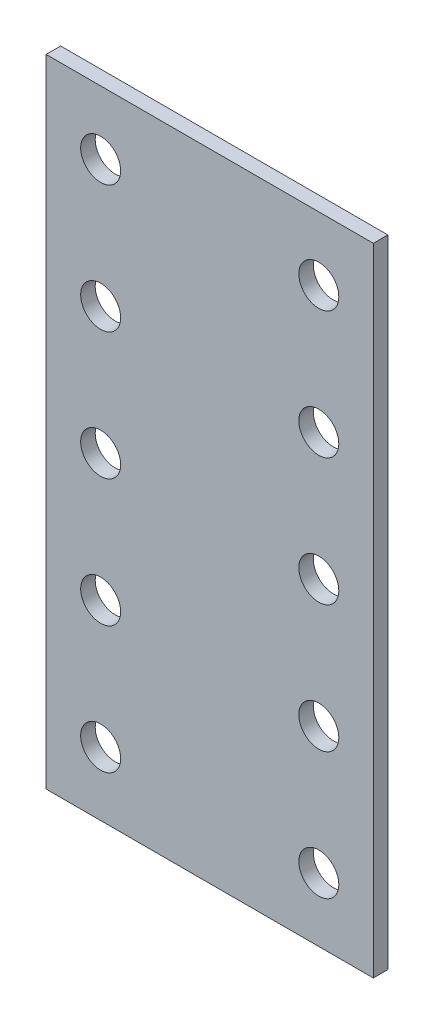
ISO-10303-21;
HEADER;
FILE_DESCRIPTION(('STEP AP214'),'2;1');
FILE_NAME('part.step','',(''),(''),'','','');
FILE_SCHEMA(('AUTOMOTIVE_DESIGN { 1 0 10303 214 1 1 1 1 }'));
ENDSEC;
DATA;
#1=APPLICATION_CONTEXT('core data for automotive mechanical design processes');
#2=APPLICATION_PROTOCOL_DEFINITION('international standard','automotive_design',2000,#1);
#3=PRODUCT_CONTEXT('',#1,'mechanical');
#4=PRODUCT('Part','Part','',(#3));
#5=PRODUCT_RELATED_PRODUCT_CATEGORY('part','',(#4));
#6=PRODUCT_DEFINITION_FORMATION('','',#4);
#7=PRODUCT_DEFINITION_CONTEXT('part definition',#1,'design');
#8=PRODUCT_DEFINITION('design','',#6,#7);
#9=PRODUCT_DEFINITION_SHAPE('','',#8);
#10=(LENGTH_UNIT() NAMED_UNIT(*) SI_UNIT(.MILLI.,.METRE.));
#11=(NAMED_UNIT(*) PLANE_ANGLE_UNIT() SI_UNIT($,.RADIAN.));
#12=(NAMED_UNIT(*) SI_UNIT($,.STERADIAN.) SOLID_ANGLE_UNIT());
#13=UNCERTAINTY_MEASURE_WITH_UNIT(LENGTH_MEASURE(1.E-05),#10,'distance_accuracy_value','');
#14=(GEOMETRIC_REPRESENTATION_CONTEXT(3) GLOBAL_UNCERTAINTY_ASSIGNED_CONTEXT((#13)) GLOBAL_UNIT_ASSIGNED_CONTEXT((#10,
#11,#12)) REPRESENTATION_CONTEXT('',''));
#15=CARTESIAN_POINT('',(0.,0.,0.));
#16=DIRECTION('',(0.,0.,1.));
#17=DIRECTION('',(1.,0.,0.));
#18=AXIS2_PLACEMENT_3D('',#15,#16,#17);
#19=CARTESIAN_POINT('',(60.,-140.,4.));
#20=DIRECTION('',(0.,0.,1.));
#21=DIRECTION('',(1.,0.,0.));
#22=AXIS2_PLACEMENT_3D('',#19,#20,#21);
#23=CYLINDRICAL_SURFACE('',#22,11.);
#24=CARTESIAN_POINT('',(60.,-140.,4.));
#25=DIRECTION('',(0.,0.,1.));
#26=DIRECTION('',(1.,0.,0.));
#27=AXIS2_PLACEMENT_3D('',#24,#25,#26);
#28=CIRCLE('',#27,11.);
#29=CARTESIAN_POINT('',(71.,-140.,4.));
#30=VERTEX_POINT('',#29);
#31=EDGE_CURVE('E49',#30,#30,#28,.T.);
#32=ORIENTED_EDGE('',*,*,#31,.T.);
#33=EDGE_LOOP('',(#32));
#34=FACE_BOUND('',#33,.T.);
#35=CARTESIAN_POINT('',(60.,-140.,-4.));
#36=DIRECTION('',(0.,0.,-1.));
#37=DIRECTION('',(-1.,0.,0.));
#38=AXIS2_PLACEMENT_3D('',#35,#36,#37);
#39=CIRCLE('',#38,11.);
#40=CARTESIAN_POINT('',(49.,-140.,-4.));
#41=VERTEX_POINT('',#40);
#42=EDGE_CURVE('E11',#41,#41,#39,.T.);
#43=ORIENTED_EDGE('',*,*,#42,.T.);
#44=EDGE_LOOP('',(#43));
#45=FACE_BOUND('',#44,.T.);
#46=ADVANCED_FACE('F41',(#34,#45),#23,.F.);
#47=CARTESIAN_POINT('',(60.,-70.,4.));
#48=DIRECTION('',(0.,0.,1.));
#49=DIRECTION('',(1.,0.,0.));
#50=AXIS2_PLACEMENT_3D('',#47,#48,#49);
#51=CYLINDRICAL_SURFACE('',#50,11.);
#52=CARTESIAN_POINT('',(60.,-70.,4.));
#53=DIRECTION('',(0.,0.,1.));
#54=DIRECTION('',(1.,0.,0.));
#55=AXIS2_PLACEMENT_3D('',#52,#53,#54);
#56=CIRCLE('',#55,11.);
#57=CARTESIAN_POINT('',(71.,-70.,4.));
#58=VERTEX_POINT('',#57);
#59=EDGE_CURVE('E146',#58,#58,#56,.T.);
#60=ORIENTED_EDGE('',*,*,#59,.T.);
#61=EDGE_LOOP('',(#60));
#62=FACE_BOUND('',#61,.T.);
#63=CARTESIAN_POINT('',(60.,-70.,-4.));
#64=DIRECTION('',(0.,0.,-1.));
#65=DIRECTION('',(-1.,0.,0.));
#66=AXIS2_PLACEMENT_3D('',#63,#64,#65);
#67=CIRCLE('',#66,11.);
#68=CARTESIAN_POINT('',(49.,-70.,-4.));
#69=VERTEX_POINT('',#68);
#70=EDGE_CURVE('E149',#69,#69,#67,.T.);
#71=ORIENTED_EDGE('',*,*,#70,.T.);
#72=EDGE_LOOP('',(#71));
#73=FACE_BOUND('',#72,.T.);
#74=ADVANCED_FACE('F175',(#62,#73),#51,.F.);
#75=CARTESIAN_POINT('',(60.,0.,4.));
#76=DIRECTION('',(0.,0.,1.));
#77=DIRECTION('',(1.,0.,0.));
#78=AXIS2_PLACEMENT_3D('',#75,#76,#77);
#79=CYLINDRICAL_SURFACE('',#78,11.);
#80=CARTESIAN_POINT('',(60.,0.,4.));
#81=DIRECTION('',(0.,0.,1.));
#82=DIRECTION('',(1.,0.,0.));
#83=AXIS2_PLACEMENT_3D('',#80,#81,#82);
#84=CIRCLE('',#83,11.);
#85=CARTESIAN_POINT('',(71.,0.,4.));
#86=VERTEX_POINT('',#85);
#87=EDGE_CURVE('E140',#86,#86,#84,.T.);
#88=ORIENTED_EDGE('',*,*,#87,.T.);
#89=EDGE_LOOP('',(#88));
#90=FACE_BOUND('',#89,.T.);
#91=CARTESIAN_POINT('',(60.,0.,-4.));
#92=DIRECTION('',(0.,0.,-1.));
#93=DIRECTION('',(-1.,0.,0.));
#94=AXIS2_PLACEMENT_3D('',#91,#92,#93);
#95=CIRCLE('',#94,11.);
#96=CARTESIAN_POINT('',(49.,0.,-4.));
#97=VERTEX_POINT('',#96);
#98=EDGE_CURVE('E143',#97,#97,#95,.T.);
#99=ORIENTED_EDGE('',*,*,#98,.T.);
#100=EDGE_LOOP('',(#99));
#101=FACE_BOUND('',#100,.T.);
#102=ADVANCED_FACE('F180',(#90,#101),#79,.F.);
#103=CARTESIAN_POINT('',(-60.,-140.,4.));
#104=DIRECTION('',(0.,0.,1.));
#105=DIRECTION('',(1.,0.,0.));
#106=AXIS2_PLACEMENT_3D('',#103,#104,#105);
#107=CYLINDRICAL_SURFACE('',#106,11.);
#108=CARTESIAN_POINT('',(-60.,-140.,4.));
#109=DIRECTION('',(0.,0.,1.));
#110=DIRECTION('',(1.,0.,0.));
#111=AXIS2_PLACEMENT_3D('',#108,#109,#110);
#112=CIRCLE('',#111,11.);
#113=CARTESIAN_POINT('',(-49.,-140.,4.));
#114=VERTEX_POINT('',#113);
#115=EDGE_CURVE('E134',#114,#114,#112,.T.);
#116=ORIENTED_EDGE('',*,*,#115,.T.);
#117=EDGE_LOOP('',(#116));
#118=FACE_BOUND('',#117,.T.);
#119=CARTESIAN_POINT('',(-60.,-140.,-4.));
#120=DIRECTION('',(0.,0.,-1.));
#121=DIRECTION('',(-1.,0.,0.));
#122=AXIS2_PLACEMENT_3D('',#119,#120,#121);
#123=CIRCLE('',#122,11.);
#124=CARTESIAN_POINT('',(-71.,-140.,-4.));
#125=VERTEX_POINT('',#124);
#126=EDGE_CURVE('E137',#125,#125,#123,.T.);
#127=ORIENTED_EDGE('',*,*,#126,.T.);
#128=EDGE_LOOP('',(#127));
#129=FACE_BOUND('',#128,.T.);
#130=ADVANCED_FACE('F185',(#118,#129),#107,.F.);
#131=CARTESIAN_POINT('',(-60.,-70.,4.));
#132=DIRECTION('',(0.,0.,1.));
#133=DIRECTION('',(1.,0.,0.));
#134=AXIS2_PLACEMENT_3D('',#131,#132,#133);
#135=CYLINDRICAL_SURFACE('',#134,11.);
#136=CARTESIAN_POINT('',(-60.,-70.,4.));
#137=DIRECTION('',(0.,0.,1.));
#138=DIRECTION('',(1.,0.,0.));
#139=AXIS2_PLACEMENT_3D('',#136,#137,#138);
#140=CIRCLE('',#139,11.);
#141=CARTESIAN_POINT('',(-49.,-70.,4.));
#142=VERTEX_POINT('',#141);
#143=EDGE_CURVE('E128',#142,#142,#140,.T.);
#144=ORIENTED_EDGE('',*,*,#143,.T.);
#145=EDGE_LOOP('',(#144));
#146=FACE_BOUND('',#145,.T.);
#147=CARTESIAN_POINT('',(-60.,-70.,-4.));
#148=DIRECTION('',(0.,0.,-1.));
#149=DIRECTION('',(-1.,0.,0.));
#150=AXIS2_PLACEMENT_3D('',#147,#148,#149);
#151=CIRCLE('',#150,11.);
#152=CARTESIAN_POINT('',(-71.,-70.,-4.));
#153=VERTEX_POINT('',#152);
#154=EDGE_CURVE('E131',#153,#153,#151,.T.);
#155=ORIENTED_EDGE('',*,*,#154,.T.);
#156=EDGE_LOOP('',(#155));
#157=FACE_BOUND('',#156,.T.);
#158=ADVANCED_FACE('F192',(#146,#157),#135,.F.);
#159=CARTESIAN_POINT('',(-60.,0.,4.));
#160=DIRECTION('',(0.,0.,1.));
#161=DIRECTION('',(1.,0.,0.));
#162=AXIS2_PLACEMENT_3D('',#159,#160,#161);
#163=CYLINDRICAL_SURFACE('',#162,11.);
#164=CARTESIAN_POINT('',(-60.,0.,4.));
#165=DIRECTION('',(0.,0.,1.));
#166=DIRECTION('',(1.,0.,0.));
#167=AXIS2_PLACEMENT_3D('',#164,#165,#166);
#168=CIRCLE('',#167,11.);
#169=CARTESIAN_POINT('',(-49.,0.,4.));
#170=VERTEX_POINT('',#169);
#171=EDGE_CURVE('E120',#170,#170,#168,.T.);
#172=ORIENTED_EDGE('',*,*,#171,.T.);
#173=EDGE_LOOP('',(#172));
#174=FACE_BOUND('',#173,.T.);
#175=CARTESIAN_POINT('',(-60.,0.,-4.));
#176=DIRECTION('',(0.,0.,-1.));
#177=DIRECTION('',(-1.,0.,0.));
#178=AXIS2_PLACEMENT_3D('',#175,#176,#177);
#179=CIRCLE('',#178,11.);
#180=CARTESIAN_POINT('',(-71.,0.,-4.));
#181=VERTEX_POINT('',#180);
#182=EDGE_CURVE('E125',#181,#181,#179,.T.);
#183=ORIENTED_EDGE('',*,*,#182,.T.);
#184=EDGE_LOOP('',(#183));
#185=FACE_BOUND('',#184,.T.);
#186=ADVANCED_FACE('F196',(#174,#185),#163,.F.);
#187=CARTESIAN_POINT('',(90.,-175.,-4.));
#188=DIRECTION('',(1.,0.,0.));
#189=DIRECTION('',(0.,0.,-1.));
#190=AXIS2_PLACEMENT_3D('',#187,#188,#189);
#191=PLANE('',#190);
#192=DIRECTION('',(0.,1.,0.));
#193=VECTOR('',#192,1.);
#194=CARTESIAN_POINT('',(90.,-175.,4.));
#195=LINE('',#194,#193);
#196=CARTESIAN_POINT('',(90.,-175.,4.));
#197=VERTEX_POINT('',#196);
#198=CARTESIAN_POINT('',(90.,175.,4.));
#199=VERTEX_POINT('',#198);
#200=EDGE_CURVE('E110',#197,#199,#195,.T.);
#201=ORIENTED_EDGE('',*,*,#200,.F.);
#202=DIRECTION('',(0.,0.,1.));
#203=VECTOR('',#202,1.);
#204=CARTESIAN_POINT('',(90.,-175.,-4.));
#205=LINE('',#204,#203);
#206=CARTESIAN_POINT('',(90.,-175.,-4.));
#207=VERTEX_POINT('',#206);
#208=EDGE_CURVE('E57',#207,#197,#205,.T.);
#209=ORIENTED_EDGE('',*,*,#208,.F.);
#210=DIRECTION('',(0.,1.,0.));
#211=VECTOR('',#210,1.);
#212=CARTESIAN_POINT('',(90.,-175.,-4.));
#213=LINE('',#212,#211);
#214=CARTESIAN_POINT('',(90.,175.,-4.));
#215=VERTEX_POINT('',#214);
#216=EDGE_CURVE('E103',#207,#215,#213,.T.);
#217=ORIENTED_EDGE('',*,*,#216,.T.);
#218=DIRECTION('',(0.,0.,1.));
#219=VECTOR('',#218,1.);
#220=CARTESIAN_POINT('',(90.,175.,-4.));
#221=LINE('',#220,#219);
#222=EDGE_CURVE('E85',#215,#199,#221,.T.);
#223=ORIENTED_EDGE('',*,*,#222,.T.);
#224=EDGE_LOOP('',(#201,#209,#217,#223));
#225=FACE_BOUND('',#224,.T.);
#226=ADVANCED_FACE('F200',(#225),#191,.T.);
#227=CARTESIAN_POINT('',(-90.,-175.,-4.));
#228=DIRECTION('',(0.,-1.,0.));
#229=DIRECTION('',(0.,0.,-1.));
#230=AXIS2_PLACEMENT_3D('',#227,#228,#229);
#231=PLANE('',#230);
#232=DIRECTION('',(1.,0.,0.));
#233=VECTOR('',#232,1.);
#234=CARTESIAN_POINT('',(-90.,-175.,4.));
#235=LINE('',#234,#233);
#236=CARTESIAN_POINT('',(-90.,-175.,4.));
#237=VERTEX_POINT('',#236);
#238=EDGE_CURVE('E105',#237,#197,#235,.T.);
#239=ORIENTED_EDGE('',*,*,#238,.F.);
#240=DIRECTION('',(0.,0.,1.));
#241=VECTOR('',#240,1.);
#242=CARTESIAN_POINT('',(-90.,-175.,-4.));
#243=LINE('',#242,#241);
#244=CARTESIAN_POINT('',(-90.,-175.,-4.));
#245=VERTEX_POINT('',#244);
#246=EDGE_CURVE('E74',#245,#237,#243,.T.);
#247=ORIENTED_EDGE('',*,*,#246,.F.);
#248=DIRECTION('',(1.,0.,0.));
#249=VECTOR('',#248,1.);
#250=CARTESIAN_POINT('',(-90.,-175.,-4.));
#251=LINE('',#250,#249);
#252=EDGE_CURVE('E100',#245,#207,#251,.T.);
#253=ORIENTED_EDGE('',*,*,#252,.T.);
#254=ORIENTED_EDGE('',*,*,#208,.T.);
#255=EDGE_LOOP('',(#239,#247,#253,#254));
#256=FACE_BOUND('',#255,.T.);
#257=ADVANCED_FACE('F204',(#256),#231,.T.);
#258=CARTESIAN_POINT('',(-90.,-175.,-4.));
#259=DIRECTION('',(-1.,0.,0.));
#260=DIRECTION('',(0.,0.,1.));
#261=AXIS2_PLACEMENT_3D('',#258,#259,#260);
#262=PLANE('',#261);
#263=DIRECTION('',(0.,-1.,0.));
#264=VECTOR('',#263,1.);
#265=CARTESIAN_POINT('',(-90.,-175.,4.));
#266=LINE('',#265,#264);
#267=CARTESIAN_POINT('',(-90.,175.,4.));
#268=VERTEX_POINT('',#267);
#269=EDGE_CURVE('E93',#268,#237,#266,.T.);
#270=ORIENTED_EDGE('',*,*,#269,.F.);
#271=DIRECTION('',(0.,0.,1.));
#272=VECTOR('',#271,1.);
#273=CARTESIAN_POINT('',(-90.,175.,-4.));
#274=LINE('',#273,#272);
#275=CARTESIAN_POINT('',(-90.,175.,-4.));
#276=VERTEX_POINT('',#275);
#277=EDGE_CURVE('E88',#276,#268,#274,.T.);
#278=ORIENTED_EDGE('',*,*,#277,.F.);
#279=DIRECTION('',(0.,-1.,0.));
#280=VECTOR('',#279,1.);
#281=CARTESIAN_POINT('',(-90.,-175.,-4.));
#282=LINE('',#281,#280);
#283=EDGE_CURVE('E91',#276,#245,#282,.T.);
#284=ORIENTED_EDGE('',*,*,#283,.T.);
#285=ORIENTED_EDGE('',*,*,#246,.T.);
#286=EDGE_LOOP('',(#270,#278,#284,#285));
#287=FACE_BOUND('',#286,.T.);
#288=ADVANCED_FACE('F90',(#287),#262,.T.);
#289=CARTESIAN_POINT('',(-90.,175.,-4.));
#290=DIRECTION('',(0.,1.,0.));
#291=DIRECTION('',(0.,0.,1.));
#292=AXIS2_PLACEMENT_3D('',#289,#290,#291);
#293=PLANE('',#292);
#294=DIRECTION('',(-1.,0.,0.));
#295=VECTOR('',#294,1.);
#296=CARTESIAN_POINT('',(-90.,175.,4.));
#297=LINE('',#296,#295);
#298=EDGE_CURVE('E113',#199,#268,#297,.T.);
#299=ORIENTED_EDGE('',*,*,#298,.F.);
#300=ORIENTED_EDGE('',*,*,#222,.F.);
#301=DIRECTION('',(-1.,0.,0.));
#302=VECTOR('',#301,1.);
#303=CARTESIAN_POINT('',(-90.,175.,-4.));
#304=LINE('',#303,#302);
#305=EDGE_CURVE('E99',#215,#276,#304,.T.);
#306=ORIENTED_EDGE('',*,*,#305,.T.);
#307=ORIENTED_EDGE('',*,*,#277,.T.);
#308=EDGE_LOOP('',(#299,#300,#306,#307));
#309=FACE_BOUND('',#308,.T.);
#310=ADVANCED_FACE('F102',(#309),#293,.T.);
#311=CARTESIAN_POINT('',(0.,0.,-4.));
#312=DIRECTION('',(0.,0.,-1.));
#313=DIRECTION('',(-1.,0.,0.));
#314=AXIS2_PLACEMENT_3D('',#311,#312,#313);
#315=PLANE('',#314);
#316=CARTESIAN_POINT('',(60.,70.,-4.));
#317=DIRECTION('',(0.,0.,-1.));
#318=DIRECTION('',(-1.,0.,0.));
#319=AXIS2_PLACEMENT_3D('',#316,#317,#318);
#320=CIRCLE('',#319,11.);
#321=CARTESIAN_POINT('',(49.,70.,-4.));
#322=VERTEX_POINT('',#321);
#323=EDGE_CURVE('E322',#322,#322,#320,.T.);
#324=ORIENTED_EDGE('',*,*,#323,.F.);
#325=EDGE_LOOP('',(#324));
#326=FACE_BOUND('',#325,.T.);
#327=CARTESIAN_POINT('',(-60.,70.,-4.));
#328=DIRECTION('',(0.,0.,-1.));
#329=DIRECTION('',(-1.,0.,0.));
#330=AXIS2_PLACEMENT_3D('',#327,#328,#329);
#331=CIRCLE('',#330,11.);
#332=CARTESIAN_POINT('',(-71.,70.,-4.));
#333=VERTEX_POINT('',#332);
#334=EDGE_CURVE('E326',#333,#333,#331,.T.);
#335=ORIENTED_EDGE('',*,*,#334,.F.);
#336=EDGE_LOOP('',(#335));
#337=FACE_BOUND('',#336,.T.);
#338=CARTESIAN_POINT('',(-60.,140.,-4.));
#339=DIRECTION('',(0.,0.,-1.));
#340=DIRECTION('',(-1.,0.,0.));
#341=AXIS2_PLACEMENT_3D('',#338,#339,#340);
#342=CIRCLE('',#341,11.);
#343=CARTESIAN_POINT('',(-71.,140.,-4.));
#344=VERTEX_POINT('',#343);
#345=EDGE_CURVE('E335',#344,#344,#342,.T.);
#346=ORIENTED_EDGE('',*,*,#345,.F.);
#347=EDGE_LOOP('',(#346));
#348=FACE_BOUND('',#347,.T.);
#349=CARTESIAN_POINT('',(60.,140.,-4.));
#350=DIRECTION('',(0.,0.,-1.));
#351=DIRECTION('',(-1.,0.,0.));
#352=AXIS2_PLACEMENT_3D('',#349,#350,#351);
#353=CIRCLE('',#352,11.);
#354=CARTESIAN_POINT('',(49.,140.,-4.));
#355=VERTEX_POINT('',#354);
#356=EDGE_CURVE('E114',#355,#355,#353,.T.);
#357=ORIENTED_EDGE('',*,*,#356,.F.);
#358=EDGE_LOOP('',(#357));
#359=FACE_BOUND('',#358,.T.);
#360=ORIENTED_EDGE('',*,*,#216,.F.);
#361=ORIENTED_EDGE('',*,*,#252,.F.);
#362=ORIENTED_EDGE('',*,*,#283,.F.);
#363=ORIENTED_EDGE('',*,*,#305,.F.);
#364=EDGE_LOOP('',(#360,#361,#362,#363));
#365=FACE_BOUND('',#364,.T.);
#366=ORIENTED_EDGE('',*,*,#182,.F.);
#367=EDGE_LOOP('',(#366));
#368=FACE_BOUND('',#367,.T.);
#369=ORIENTED_EDGE('',*,*,#154,.F.);
#370=EDGE_LOOP('',(#369));
#371=FACE_BOUND('',#370,.T.);
#372=ORIENTED_EDGE('',*,*,#126,.F.);
#373=EDGE_LOOP('',(#372));
#374=FACE_BOUND('',#373,.T.);
#375=ORIENTED_EDGE('',*,*,#98,.F.);
#376=EDGE_LOOP('',(#375));
#377=FACE_BOUND('',#376,.T.);
#378=ORIENTED_EDGE('',*,*,#70,.F.);
#379=EDGE_LOOP('',(#378));
#380=FACE_BOUND('',#379,.T.);
#381=ORIENTED_EDGE('',*,*,#42,.F.);
#382=EDGE_LOOP('',(#381));
#383=FACE_BOUND('',#382,.T.);
#384=ADVANCED_FACE('F97',(#326,#337,#348,#359,#365,#368,#371,#374,#377,#380,#383),#315,.T.);
#385=CARTESIAN_POINT('',(0.,0.,4.));
#386=DIRECTION('',(0.,0.,-1.));
#387=DIRECTION('',(-1.,0.,0.));
#388=AXIS2_PLACEMENT_3D('',#385,#386,#387);
#389=PLANE('',#388);
#390=CARTESIAN_POINT('',(60.,70.,4.));
#391=DIRECTION('',(0.,0.,1.));
#392=DIRECTION('',(1.,0.,0.));
#393=AXIS2_PLACEMENT_3D('',#390,#391,#392);
#394=CIRCLE('',#393,11.);
#395=CARTESIAN_POINT('',(71.,70.,4.));
#396=VERTEX_POINT('',#395);
#397=EDGE_CURVE('E319',#396,#396,#394,.T.);
#398=ORIENTED_EDGE('',*,*,#397,.F.);
#399=EDGE_LOOP('',(#398));
#400=FACE_BOUND('',#399,.T.);
#401=CARTESIAN_POINT('',(-60.,70.,4.));
#402=DIRECTION('',(0.,0.,1.));
#403=DIRECTION('',(1.,0.,0.));
#404=AXIS2_PLACEMENT_3D('',#401,#402,#403);
#405=CIRCLE('',#404,11.);
#406=CARTESIAN_POINT('',(-49.,70.,4.));
#407=VERTEX_POINT('',#406);
#408=EDGE_CURVE('E323',#407,#407,#405,.T.);
#409=ORIENTED_EDGE('',*,*,#408,.F.);
#410=EDGE_LOOP('',(#409));
#411=FACE_BOUND('',#410,.T.);
#412=CARTESIAN_POINT('',(-60.,140.,4.));
#413=DIRECTION('',(0.,0.,1.));
#414=DIRECTION('',(1.,0.,0.));
#415=AXIS2_PLACEMENT_3D('',#412,#413,#414);
#416=CIRCLE('',#415,11.);
#417=CARTESIAN_POINT('',(-49.,140.,4.));
#418=VERTEX_POINT('',#417);
#419=EDGE_CURVE('E332',#418,#418,#416,.T.);
#420=ORIENTED_EDGE('',*,*,#419,.F.);
#421=EDGE_LOOP('',(#420));
#422=FACE_BOUND('',#421,.T.);
#423=CARTESIAN_POINT('',(60.,140.,4.));
#424=DIRECTION('',(0.,0.,1.));
#425=DIRECTION('',(1.,0.,0.));
#426=AXIS2_PLACEMENT_3D('',#423,#424,#425);
#427=CIRCLE('',#426,11.);
#428=CARTESIAN_POINT('',(71.,140.,4.));
#429=VERTEX_POINT('',#428);
#430=EDGE_CURVE('E338',#429,#429,#427,.T.);
#431=ORIENTED_EDGE('',*,*,#430,.F.);
#432=EDGE_LOOP('',(#431));
#433=FACE_BOUND('',#432,.T.);
#434=ORIENTED_EDGE('',*,*,#200,.T.);
#435=ORIENTED_EDGE('',*,*,#298,.T.);
#436=ORIENTED_EDGE('',*,*,#269,.T.);
#437=ORIENTED_EDGE('',*,*,#238,.T.);
#438=EDGE_LOOP('',(#434,#435,#436,#437));
#439=FACE_BOUND('',#438,.T.);
#440=ORIENTED_EDGE('',*,*,#171,.F.);
#441=EDGE_LOOP('',(#440));
#442=FACE_BOUND('',#441,.T.);
#443=ORIENTED_EDGE('',*,*,#143,.F.);
#444=EDGE_LOOP('',(#443));
#445=FACE_BOUND('',#444,.T.);
#446=ORIENTED_EDGE('',*,*,#115,.F.);
#447=EDGE_LOOP('',(#446));
#448=FACE_BOUND('',#447,.T.);
#449=ORIENTED_EDGE('',*,*,#87,.F.);
#450=EDGE_LOOP('',(#449));
#451=FACE_BOUND('',#450,.T.);
#452=ORIENTED_EDGE('',*,*,#59,.F.);
#453=EDGE_LOOP('',(#452));
#454=FACE_BOUND('',#453,.T.);
#455=ORIENTED_EDGE('',*,*,#31,.F.);
#456=EDGE_LOOP('',(#455));
#457=FACE_BOUND('',#456,.T.);
#458=ADVANCED_FACE('F156',(#400,#411,#422,#433,#439,#442,#445,#448,#451,#454,#457),#389,.F.);
#459=CARTESIAN_POINT('',(60.,140.,4.));
#460=DIRECTION('',(0.,0.,1.));
#461=DIRECTION('',(1.,0.,0.));
#462=AXIS2_PLACEMENT_3D('',#459,#460,#461);
#463=CYLINDRICAL_SURFACE('',#462,11.);
#464=ORIENTED_EDGE('',*,*,#430,.T.);
#465=EDGE_LOOP('',(#464));
#466=FACE_BOUND('',#465,.T.);
#467=ORIENTED_EDGE('',*,*,#356,.T.);
#468=EDGE_LOOP('',(#467));
#469=FACE_BOUND('',#468,.T.);
#470=ADVANCED_FACE('F158',(#466,#469),#463,.F.);
#471=CARTESIAN_POINT('',(-60.,140.,4.));
#472=DIRECTION('',(0.,0.,1.));
#473=DIRECTION('',(1.,0.,0.));
#474=AXIS2_PLACEMENT_3D('',#471,#472,#473);
#475=CYLINDRICAL_SURFACE('',#474,11.);
#476=ORIENTED_EDGE('',*,*,#419,.T.);
#477=EDGE_LOOP('',(#476));
#478=FACE_BOUND('',#477,.T.);
#479=ORIENTED_EDGE('',*,*,#345,.T.);
#480=EDGE_LOOP('',(#479));
#481=FACE_BOUND('',#480,.T.);
#482=ADVANCED_FACE('F166',(#478,#481),#475,.F.);
#483=CARTESIAN_POINT('',(-60.,70.,4.));
#484=DIRECTION('',(0.,0.,1.));
#485=DIRECTION('',(1.,0.,0.));
#486=AXIS2_PLACEMENT_3D('',#483,#484,#485);
#487=CYLINDRICAL_SURFACE('',#486,11.);
#488=ORIENTED_EDGE('',*,*,#408,.T.);
#489=EDGE_LOOP('',(#488));
#490=FACE_BOUND('',#489,.T.);
#491=ORIENTED_EDGE('',*,*,#334,.T.);
#492=EDGE_LOOP('',(#491));
#493=FACE_BOUND('',#492,.T.);
#494=ADVANCED_FACE('F260',(#490,#493),#487,.F.);
#495=CARTESIAN_POINT('',(60.,70.,4.));
#496=DIRECTION('',(0.,0.,1.));
#497=DIRECTION('',(1.,0.,0.));
#498=AXIS2_PLACEMENT_3D('',#495,#496,#497);
#499=CYLINDRICAL_SURFACE('',#498,11.);
#500=ORIENTED_EDGE('',*,*,#397,.T.);
#501=EDGE_LOOP('',(#500));
#502=FACE_BOUND('',#501,.T.);
#503=ORIENTED_EDGE('',*,*,#323,.T.);
#504=EDGE_LOOP('',(#503));
#505=FACE_BOUND('',#504,.T.);
#506=ADVANCED_FACE('F305',(#502,#505),#499,.F.);
#507=CLOSED_SHELL('',(#46,#74,#102,#130,#158,#186,#226,#257,#288,#310,#384,#458,#470,#482,#494,#506));
#508=MANIFOLD_SOLID_BREP('B2',#507);
#509=ADVANCED_BREP_SHAPE_REPRESENTATION('',(#18,#508),#14);
#510=SHAPE_DEFINITION_REPRESENTATION(#9,#509);
ENDSEC;
END-ISO-10303-21;
